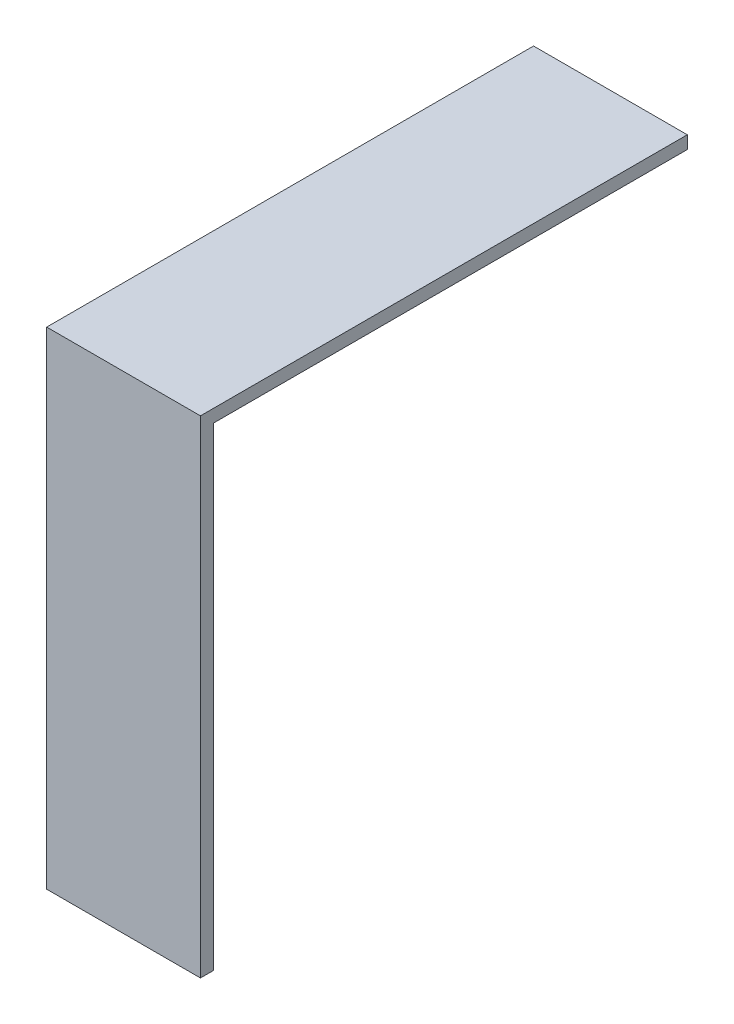
ISO-10303-21;
HEADER;
FILE_DESCRIPTION(('STEP AP214'),'2;1');
FILE_NAME('part.step','',(''),(''),'','','');
FILE_SCHEMA(('AUTOMOTIVE_DESIGN { 1 0 10303 214 1 1 1 1 }'));
ENDSEC;
DATA;
#1=APPLICATION_CONTEXT('core data for automotive mechanical design processes');
#2=APPLICATION_PROTOCOL_DEFINITION('international standard','automotive_design',2000,#1);
#3=PRODUCT_CONTEXT('',#1,'mechanical');
#4=PRODUCT('Part','Part','',(#3));
#5=PRODUCT_RELATED_PRODUCT_CATEGORY('part','',(#4));
#6=PRODUCT_DEFINITION_FORMATION('','',#4);
#7=PRODUCT_DEFINITION_CONTEXT('part definition',#1,'design');
#8=PRODUCT_DEFINITION('design','',#6,#7);
#9=PRODUCT_DEFINITION_SHAPE('','',#8);
#10=(LENGTH_UNIT() NAMED_UNIT(*) SI_UNIT(.MILLI.,.METRE.));
#11=(NAMED_UNIT(*) PLANE_ANGLE_UNIT() SI_UNIT($,.RADIAN.));
#12=(NAMED_UNIT(*) SI_UNIT($,.STERADIAN.) SOLID_ANGLE_UNIT());
#13=UNCERTAINTY_MEASURE_WITH_UNIT(LENGTH_MEASURE(1.E-05),#10,'distance_accuracy_value','');
#14=(GEOMETRIC_REPRESENTATION_CONTEXT(3) GLOBAL_UNCERTAINTY_ASSIGNED_CONTEXT((#13)) GLOBAL_UNIT_ASSIGNED_CONTEXT((#10,
#11,#12)) REPRESENTATION_CONTEXT('',''));
#15=CARTESIAN_POINT('',(0.,0.,0.));
#16=DIRECTION('',(0.,0.,1.));
#17=DIRECTION('',(1.,0.,0.));
#18=AXIS2_PLACEMENT_3D('',#15,#16,#17);
#19=CARTESIAN_POINT('',(38.1,0.,-3.175));
#20=DIRECTION('',(0.,1.,0.));
#21=DIRECTION('',(0.,0.,1.));
#22=AXIS2_PLACEMENT_3D('',#19,#20,#21);
#23=PLANE('',#22);
#24=DIRECTION('',(0.,0.,-1.));
#25=VECTOR('',#24,1.);
#26=CARTESIAN_POINT('',(0.,0.,-3.175));
#27=LINE('',#26,#25);
#28=CARTESIAN_POINT('',(0.,0.,0.));
#29=VERTEX_POINT('',#28);
#30=CARTESIAN_POINT('',(0.,0.,-3.175));
#31=VERTEX_POINT('',#30);
#32=EDGE_CURVE('E117',#29,#31,#27,.T.);
#33=ORIENTED_EDGE('',*,*,#32,.T.);
#34=DIRECTION('',(-1.,0.,0.));
#35=VECTOR('',#34,1.);
#36=CARTESIAN_POINT('',(38.1,0.,-3.175));
#37=LINE('',#36,#35);
#38=CARTESIAN_POINT('',(38.1,0.,-3.175));
#39=VERTEX_POINT('',#38);
#40=EDGE_CURVE('E11',#39,#31,#37,.T.);
#41=ORIENTED_EDGE('',*,*,#40,.F.);
#42=DIRECTION('',(0.,0.,-1.));
#43=VECTOR('',#42,1.);
#44=CARTESIAN_POINT('',(38.1,0.,-3.175));
#45=LINE('',#44,#43);
#46=CARTESIAN_POINT('',(38.1,0.,0.));
#47=VERTEX_POINT('',#46);
#48=EDGE_CURVE('E127',#47,#39,#45,.T.);
#49=ORIENTED_EDGE('',*,*,#48,.F.);
#50=DIRECTION('',(-1.,0.,0.));
#51=VECTOR('',#50,1.);
#52=CARTESIAN_POINT('',(38.1,0.,0.));
#53=LINE('',#52,#51);
#54=EDGE_CURVE('E113',#47,#29,#53,.T.);
#55=ORIENTED_EDGE('',*,*,#54,.T.);
#56=EDGE_LOOP('',(#33,#41,#49,#55));
#57=FACE_BOUND('',#56,.T.);
#58=ADVANCED_FACE('F33',(#57),#23,.F.);
#59=CARTESIAN_POINT('',(38.1,117.475,-3.17499999999998));
#60=DIRECTION('',(0.,0.,1.));
#61=DIRECTION('',(0.,-1.,0.));
#62=AXIS2_PLACEMENT_3D('',#59,#60,#61);
#63=PLANE('',#62);
#64=DIRECTION('',(0.,1.,0.));
#65=VECTOR('',#64,1.);
#66=CARTESIAN_POINT('',(0.,117.475,-3.17499999999998));
#67=LINE('',#66,#65);
#68=CARTESIAN_POINT('',(0.,117.475,-3.17499999999998));
#69=VERTEX_POINT('',#68);
#70=EDGE_CURVE('E120',#31,#69,#67,.T.);
#71=ORIENTED_EDGE('',*,*,#70,.T.);
#72=DIRECTION('',(-1.,0.,0.));
#73=VECTOR('',#72,1.);
#74=CARTESIAN_POINT('',(38.1,117.475,-3.17499999999998));
#75=LINE('',#74,#73);
#76=CARTESIAN_POINT('',(38.1,117.475,-3.17499999999998));
#77=VERTEX_POINT('',#76);
#78=EDGE_CURVE('E41',#77,#69,#75,.T.);
#79=ORIENTED_EDGE('',*,*,#78,.F.);
#80=DIRECTION('',(0.,1.,0.));
#81=VECTOR('',#80,1.);
#82=CARTESIAN_POINT('',(38.1,117.475,-3.17499999999998));
#83=LINE('',#82,#81);
#84=EDGE_CURVE('E86',#39,#77,#83,.T.);
#85=ORIENTED_EDGE('',*,*,#84,.F.);
#86=ORIENTED_EDGE('',*,*,#40,.T.);
#87=EDGE_LOOP('',(#71,#79,#85,#86));
#88=FACE_BOUND('',#87,.T.);
#89=ADVANCED_FACE('F151',(#88),#63,.F.);
#90=CARTESIAN_POINT('',(38.1,117.475,-120.65));
#91=DIRECTION('',(0.,1.,0.));
#92=DIRECTION('',(0.,0.,1.));
#93=AXIS2_PLACEMENT_3D('',#90,#91,#92);
#94=PLANE('',#93);
#95=DIRECTION('',(0.,0.,-1.));
#96=VECTOR('',#95,1.);
#97=CARTESIAN_POINT('',(0.,117.475,-120.65));
#98=LINE('',#97,#96);
#99=CARTESIAN_POINT('',(0.,117.475,-120.65));
#100=VERTEX_POINT('',#99);
#101=EDGE_CURVE('E122',#69,#100,#98,.T.);
#102=ORIENTED_EDGE('',*,*,#101,.T.);
#103=DIRECTION('',(-1.,0.,0.));
#104=VECTOR('',#103,1.);
#105=CARTESIAN_POINT('',(38.1,117.475,-120.65));
#106=LINE('',#105,#104);
#107=CARTESIAN_POINT('',(38.1,117.475,-120.65));
#108=VERTEX_POINT('',#107);
#109=EDGE_CURVE('E108',#108,#100,#106,.T.);
#110=ORIENTED_EDGE('',*,*,#109,.F.);
#111=DIRECTION('',(0.,0.,-1.));
#112=VECTOR('',#111,1.);
#113=CARTESIAN_POINT('',(38.1,117.475,-120.65));
#114=LINE('',#113,#112);
#115=EDGE_CURVE('E99',#77,#108,#114,.T.);
#116=ORIENTED_EDGE('',*,*,#115,.F.);
#117=ORIENTED_EDGE('',*,*,#78,.T.);
#118=EDGE_LOOP('',(#102,#110,#116,#117));
#119=FACE_BOUND('',#118,.T.);
#120=ADVANCED_FACE('F133',(#119),#94,.F.);
#121=CARTESIAN_POINT('',(38.1,120.65,-120.65));
#122=DIRECTION('',(0.,0.,1.));
#123=DIRECTION('',(1.,0.,0.));
#124=AXIS2_PLACEMENT_3D('',#121,#122,#123);
#125=PLANE('',#124);
#126=DIRECTION('',(0.,1.,0.));
#127=VECTOR('',#126,1.);
#128=CARTESIAN_POINT('',(0.,120.65,-120.65));
#129=LINE('',#128,#127);
#130=CARTESIAN_POINT('',(0.,120.65,-120.65));
#131=VERTEX_POINT('',#130);
#132=EDGE_CURVE('E107',#100,#131,#129,.T.);
#133=ORIENTED_EDGE('',*,*,#132,.T.);
#134=DIRECTION('',(-1.,0.,0.));
#135=VECTOR('',#134,1.);
#136=CARTESIAN_POINT('',(38.1,120.65,-120.65));
#137=LINE('',#136,#135);
#138=CARTESIAN_POINT('',(38.1,120.65,-120.65));
#139=VERTEX_POINT('',#138);
#140=EDGE_CURVE('E104',#139,#131,#137,.T.);
#141=ORIENTED_EDGE('',*,*,#140,.F.);
#142=DIRECTION('',(0.,1.,0.));
#143=VECTOR('',#142,1.);
#144=CARTESIAN_POINT('',(38.1,120.65,-120.65));
#145=LINE('',#144,#143);
#146=EDGE_CURVE('E93',#108,#139,#145,.T.);
#147=ORIENTED_EDGE('',*,*,#146,.F.);
#148=ORIENTED_EDGE('',*,*,#109,.T.);
#149=EDGE_LOOP('',(#133,#141,#147,#148));
#150=FACE_BOUND('',#149,.T.);
#151=ADVANCED_FACE('F105',(#150),#125,.F.);
#152=CARTESIAN_POINT('',(38.1,120.65,0.));
#153=DIRECTION('',(0.,-1.,0.));
#154=DIRECTION('',(0.,0.,-1.));
#155=AXIS2_PLACEMENT_3D('',#152,#153,#154);
#156=PLANE('',#155);
#157=DIRECTION('',(0.,0.,1.));
#158=VECTOR('',#157,1.);
#159=CARTESIAN_POINT('',(0.,120.65,0.));
#160=LINE('',#159,#158);
#161=CARTESIAN_POINT('',(0.,120.65,0.));
#162=VERTEX_POINT('',#161);
#163=EDGE_CURVE('E72',#131,#162,#160,.T.);
#164=ORIENTED_EDGE('',*,*,#163,.T.);
#165=DIRECTION('',(-1.,0.,0.));
#166=VECTOR('',#165,1.);
#167=CARTESIAN_POINT('',(38.1,120.65,0.));
#168=LINE('',#167,#166);
#169=CARTESIAN_POINT('',(38.1,120.65,0.));
#170=VERTEX_POINT('',#169);
#171=EDGE_CURVE('E109',#170,#162,#168,.T.);
#172=ORIENTED_EDGE('',*,*,#171,.F.);
#173=DIRECTION('',(0.,0.,1.));
#174=VECTOR('',#173,1.);
#175=CARTESIAN_POINT('',(38.1,120.65,0.));
#176=LINE('',#175,#174);
#177=EDGE_CURVE('E97',#139,#170,#176,.T.);
#178=ORIENTED_EDGE('',*,*,#177,.F.);
#179=ORIENTED_EDGE('',*,*,#140,.T.);
#180=EDGE_LOOP('',(#164,#172,#178,#179));
#181=FACE_BOUND('',#180,.T.);
#182=ADVANCED_FACE('F111',(#181),#156,.F.);
#183=CARTESIAN_POINT('',(38.1,0.,0.));
#184=DIRECTION('',(0.,0.,-1.));
#185=DIRECTION('',(-1.,0.,0.));
#186=AXIS2_PLACEMENT_3D('',#183,#184,#185);
#187=PLANE('',#186);
#188=DIRECTION('',(0.,-1.,0.));
#189=VECTOR('',#188,1.);
#190=CARTESIAN_POINT('',(0.,0.,0.));
#191=LINE('',#190,#189);
#192=EDGE_CURVE('E78',#162,#29,#191,.T.);
#193=ORIENTED_EDGE('',*,*,#192,.T.);
#194=ORIENTED_EDGE('',*,*,#54,.F.);
#195=DIRECTION('',(0.,-1.,0.));
#196=VECTOR('',#195,1.);
#197=CARTESIAN_POINT('',(38.1,0.,0.));
#198=LINE('',#197,#196);
#199=EDGE_CURVE('E49',#170,#47,#198,.T.);
#200=ORIENTED_EDGE('',*,*,#199,.F.);
#201=ORIENTED_EDGE('',*,*,#171,.T.);
#202=EDGE_LOOP('',(#193,#194,#200,#201));
#203=FACE_BOUND('',#202,.T.);
#204=ADVANCED_FACE('F140',(#203),#187,.F.);
#205=CARTESIAN_POINT('',(38.1,0.,0.));
#206=DIRECTION('',(-1.,0.,0.));
#207=DIRECTION('',(0.,0.,1.));
#208=AXIS2_PLACEMENT_3D('',#205,#206,#207);
#209=PLANE('',#208);
#210=ORIENTED_EDGE('',*,*,#48,.T.);
#211=ORIENTED_EDGE('',*,*,#84,.T.);
#212=ORIENTED_EDGE('',*,*,#115,.T.);
#213=ORIENTED_EDGE('',*,*,#146,.T.);
#214=ORIENTED_EDGE('',*,*,#177,.T.);
#215=ORIENTED_EDGE('',*,*,#199,.T.);
#216=EDGE_LOOP('',(#210,#211,#212,#213,#214,#215));
#217=FACE_BOUND('',#216,.T.);
#218=ADVANCED_FACE('F95',(#217),#209,.F.);
#219=CARTESIAN_POINT('',(0.,0.,0.));
#220=DIRECTION('',(-1.,0.,0.));
#221=DIRECTION('',(0.,0.,1.));
#222=AXIS2_PLACEMENT_3D('',#219,#220,#221);
#223=PLANE('',#222);
#224=ORIENTED_EDGE('',*,*,#32,.F.);
#225=ORIENTED_EDGE('',*,*,#192,.F.);
#226=ORIENTED_EDGE('',*,*,#163,.F.);
#227=ORIENTED_EDGE('',*,*,#132,.F.);
#228=ORIENTED_EDGE('',*,*,#101,.F.);
#229=ORIENTED_EDGE('',*,*,#70,.F.);
#230=EDGE_LOOP('',(#224,#225,#226,#227,#228,#229));
#231=FACE_BOUND('',#230,.T.);
#232=ADVANCED_FACE('F136',(#231),#223,.T.);
#233=CLOSED_SHELL('',(#58,#89,#120,#151,#182,#204,#218,#232));
#234=MANIFOLD_SOLID_BREP('B2',#233);
#235=ADVANCED_BREP_SHAPE_REPRESENTATION('',(#18,#234),#14);
#236=SHAPE_DEFINITION_REPRESENTATION(#9,#235);
ENDSEC;
END-ISO-10303-21;
